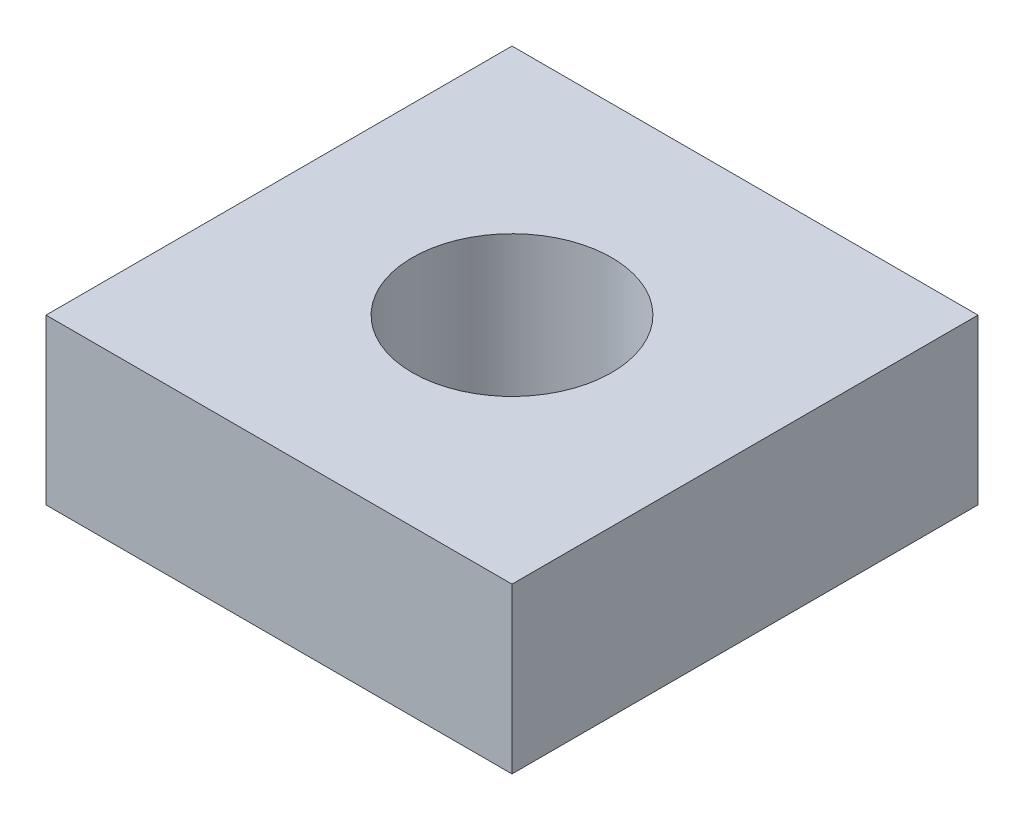
ISO-10303-21;
HEADER;
FILE_DESCRIPTION(('STEP AP214'),'2;1');
FILE_NAME('part.step','',(''),(''),'','','');
FILE_SCHEMA(('AUTOMOTIVE_DESIGN { 1 0 10303 214 1 1 1 1 }'));
ENDSEC;
DATA;
#1=APPLICATION_CONTEXT('core data for automotive mechanical design processes');
#2=APPLICATION_PROTOCOL_DEFINITION('international standard','automotive_design',2000,#1);
#3=PRODUCT_CONTEXT('',#1,'mechanical');
#4=PRODUCT('Part','Part','',(#3));
#5=PRODUCT_RELATED_PRODUCT_CATEGORY('part','',(#4));
#6=PRODUCT_DEFINITION_FORMATION('','',#4);
#7=PRODUCT_DEFINITION_CONTEXT('part definition',#1,'design');
#8=PRODUCT_DEFINITION('design','',#6,#7);
#9=PRODUCT_DEFINITION_SHAPE('','',#8);
#10=(LENGTH_UNIT() NAMED_UNIT(*) SI_UNIT(.MILLI.,.METRE.));
#11=(NAMED_UNIT(*) PLANE_ANGLE_UNIT() SI_UNIT($,.RADIAN.));
#12=(NAMED_UNIT(*) SI_UNIT($,.STERADIAN.) SOLID_ANGLE_UNIT());
#13=UNCERTAINTY_MEASURE_WITH_UNIT(LENGTH_MEASURE(1.E-05),#10,'distance_accuracy_value','');
#14=(GEOMETRIC_REPRESENTATION_CONTEXT(3) GLOBAL_UNCERTAINTY_ASSIGNED_CONTEXT((#13)) GLOBAL_UNIT_ASSIGNED_CONTEXT((#10,
#11,#12)) REPRESENTATION_CONTEXT('',''));
#15=CARTESIAN_POINT('',(0.,0.,0.));
#16=DIRECTION('',(0.,0.,1.));
#17=DIRECTION('',(1.,0.,0.));
#18=AXIS2_PLACEMENT_3D('',#15,#16,#17);
#19=CARTESIAN_POINT('',(0.,3.175,0.));
#20=DIRECTION('',(0.,1.,0.));
#21=DIRECTION('',(0.,0.,1.));
#22=AXIS2_PLACEMENT_3D('',#19,#20,#21);
#23=PLANE('',#22);
#24=DIRECTION('',(0.,0.,-1.));
#25=VECTOR('',#24,1.);
#26=CARTESIAN_POINT('',(0.,3.175,0.));
#27=LINE('',#26,#25);
#28=CARTESIAN_POINT('',(0.,3.175,0.));
#29=VERTEX_POINT('',#28);
#30=CARTESIAN_POINT('',(0.,3.175,-9.));
#31=VERTEX_POINT('',#30);
#32=EDGE_CURVE('E98',#29,#31,#27,.T.);
#33=ORIENTED_EDGE('',*,*,#32,.T.);
#34=DIRECTION('',(-1.,0.,0.));
#35=VECTOR('',#34,1.);
#36=CARTESIAN_POINT('',(0.,3.175,-9.));
#37=LINE('',#36,#35);
#38=CARTESIAN_POINT('',(-9.,3.175,-9.));
#39=VERTEX_POINT('',#38);
#40=EDGE_CURVE('E93',#31,#39,#37,.T.);
#41=ORIENTED_EDGE('',*,*,#40,.T.);
#42=DIRECTION('',(0.,0.,1.));
#43=VECTOR('',#42,1.);
#44=CARTESIAN_POINT('',(-9.,3.175,0.));
#45=LINE('',#44,#43);
#46=CARTESIAN_POINT('',(-9.,3.175,0.));
#47=VERTEX_POINT('',#46);
#48=EDGE_CURVE('E96',#39,#47,#45,.T.);
#49=ORIENTED_EDGE('',*,*,#48,.T.);
#50=DIRECTION('',(1.,0.,0.));
#51=VECTOR('',#50,1.);
#52=CARTESIAN_POINT('',(0.,3.175,0.));
#53=LINE('',#52,#51);
#54=EDGE_CURVE('E63',#47,#29,#53,.T.);
#55=ORIENTED_EDGE('',*,*,#54,.T.);
#56=EDGE_LOOP('',(#33,#41,#49,#55));
#57=FACE_BOUND('',#56,.T.);
#58=CARTESIAN_POINT('',(-4.5,3.175,-4.5));
#59=DIRECTION('',(0.,1.,0.));
#60=DIRECTION('',(0.,0.,1.));
#61=AXIS2_PLACEMENT_3D('',#58,#59,#60);
#62=CIRCLE('',#61,1.925);
#63=CARTESIAN_POINT('',(-4.5,3.175,-2.575));
#64=VERTEX_POINT('',#63);
#65=EDGE_CURVE('E118',#64,#64,#62,.T.);
#66=ORIENTED_EDGE('',*,*,#65,.F.);
#67=EDGE_LOOP('',(#66));
#68=FACE_BOUND('',#67,.T.);
#69=ADVANCED_FACE('F45',(#57,#68),#23,.T.);
#70=CARTESIAN_POINT('',(0.,0.,0.));
#71=DIRECTION('',(0.,1.,0.));
#72=DIRECTION('',(0.,0.,1.));
#73=AXIS2_PLACEMENT_3D('',#70,#71,#72);
#74=PLANE('',#73);
#75=DIRECTION('',(0.,0.,-1.));
#76=VECTOR('',#75,1.);
#77=CARTESIAN_POINT('',(0.,0.,0.));
#78=LINE('',#77,#76);
#79=CARTESIAN_POINT('',(0.,0.,0.));
#80=VERTEX_POINT('',#79);
#81=CARTESIAN_POINT('',(0.,0.,-9.));
#82=VERTEX_POINT('',#81);
#83=EDGE_CURVE('E114',#80,#82,#78,.T.);
#84=ORIENTED_EDGE('',*,*,#83,.F.);
#85=DIRECTION('',(1.,0.,0.));
#86=VECTOR('',#85,1.);
#87=CARTESIAN_POINT('',(0.,0.,0.));
#88=LINE('',#87,#86);
#89=CARTESIAN_POINT('',(-9.,0.,0.));
#90=VERTEX_POINT('',#89);
#91=EDGE_CURVE('E86',#90,#80,#88,.T.);
#92=ORIENTED_EDGE('',*,*,#91,.F.);
#93=DIRECTION('',(0.,0.,1.));
#94=VECTOR('',#93,1.);
#95=CARTESIAN_POINT('',(-9.,0.,0.));
#96=LINE('',#95,#94);
#97=CARTESIAN_POINT('',(-9.,0.,-9.));
#98=VERTEX_POINT('',#97);
#99=EDGE_CURVE('E80',#98,#90,#96,.T.);
#100=ORIENTED_EDGE('',*,*,#99,.F.);
#101=DIRECTION('',(-1.,0.,0.));
#102=VECTOR('',#101,1.);
#103=CARTESIAN_POINT('',(0.,0.,-9.));
#104=LINE('',#103,#102);
#105=EDGE_CURVE('E103',#82,#98,#104,.T.);
#106=ORIENTED_EDGE('',*,*,#105,.F.);
#107=EDGE_LOOP('',(#84,#92,#100,#106));
#108=FACE_BOUND('',#107,.T.);
#109=CARTESIAN_POINT('',(-4.5,0.,-4.5));
#110=DIRECTION('',(0.,1.,0.));
#111=DIRECTION('',(0.,0.,1.));
#112=AXIS2_PLACEMENT_3D('',#109,#110,#111);
#113=CIRCLE('',#112,1.925);
#114=CARTESIAN_POINT('',(-4.5,0.,-2.575));
#115=VERTEX_POINT('',#114);
#116=EDGE_CURVE('E136',#115,#115,#113,.T.);
#117=ORIENTED_EDGE('',*,*,#116,.T.);
#118=EDGE_LOOP('',(#117));
#119=FACE_BOUND('',#118,.T.);
#120=ADVANCED_FACE('F131',(#108,#119),#74,.F.);
#121=CARTESIAN_POINT('',(0.,3.175,0.));
#122=DIRECTION('',(-1.,0.,0.));
#123=DIRECTION('',(0.,0.,1.));
#124=AXIS2_PLACEMENT_3D('',#121,#122,#123);
#125=PLANE('',#124);
#126=ORIENTED_EDGE('',*,*,#83,.T.);
#127=DIRECTION('',(0.,-1.,0.));
#128=VECTOR('',#127,1.);
#129=CARTESIAN_POINT('',(0.,3.175,-9.));
#130=LINE('',#129,#128);
#131=EDGE_CURVE('E11',#31,#82,#130,.T.);
#132=ORIENTED_EDGE('',*,*,#131,.F.);
#133=ORIENTED_EDGE('',*,*,#32,.F.);
#134=DIRECTION('',(0.,-1.,0.));
#135=VECTOR('',#134,1.);
#136=CARTESIAN_POINT('',(0.,3.175,0.));
#137=LINE('',#136,#135);
#138=EDGE_CURVE('E110',#29,#80,#137,.T.);
#139=ORIENTED_EDGE('',*,*,#138,.T.);
#140=EDGE_LOOP('',(#126,#132,#133,#139));
#141=FACE_BOUND('',#140,.T.);
#142=ADVANCED_FACE('F47',(#141),#125,.F.);
#143=CARTESIAN_POINT('',(0.,3.175,-9.));
#144=DIRECTION('',(0.,0.,1.));
#145=DIRECTION('',(1.,0.,0.));
#146=AXIS2_PLACEMENT_3D('',#143,#144,#145);
#147=PLANE('',#146);
#148=ORIENTED_EDGE('',*,*,#105,.T.);
#149=DIRECTION('',(0.,-1.,0.));
#150=VECTOR('',#149,1.);
#151=CARTESIAN_POINT('',(-9.,3.175,-9.));
#152=LINE('',#151,#150);
#153=EDGE_CURVE('E55',#39,#98,#152,.T.);
#154=ORIENTED_EDGE('',*,*,#153,.F.);
#155=ORIENTED_EDGE('',*,*,#40,.F.);
#156=ORIENTED_EDGE('',*,*,#131,.T.);
#157=EDGE_LOOP('',(#148,#154,#155,#156));
#158=FACE_BOUND('',#157,.T.);
#159=ADVANCED_FACE('F102',(#158),#147,.F.);
#160=CARTESIAN_POINT('',(-9.,3.175,0.));
#161=DIRECTION('',(1.,0.,0.));
#162=DIRECTION('',(0.,0.,-1.));
#163=AXIS2_PLACEMENT_3D('',#160,#161,#162);
#164=PLANE('',#163);
#165=ORIENTED_EDGE('',*,*,#99,.T.);
#166=DIRECTION('',(0.,-1.,0.));
#167=VECTOR('',#166,1.);
#168=CARTESIAN_POINT('',(-9.,3.175,0.));
#169=LINE('',#168,#167);
#170=EDGE_CURVE('E105',#47,#90,#169,.T.);
#171=ORIENTED_EDGE('',*,*,#170,.F.);
#172=ORIENTED_EDGE('',*,*,#48,.F.);
#173=ORIENTED_EDGE('',*,*,#153,.T.);
#174=EDGE_LOOP('',(#165,#171,#172,#173));
#175=FACE_BOUND('',#174,.T.);
#176=ADVANCED_FACE('F106',(#175),#164,.F.);
#177=CARTESIAN_POINT('',(0.,3.175,0.));
#178=DIRECTION('',(0.,0.,-1.));
#179=DIRECTION('',(-1.,0.,0.));
#180=AXIS2_PLACEMENT_3D('',#177,#178,#179);
#181=PLANE('',#180);
#182=ORIENTED_EDGE('',*,*,#91,.T.);
#183=ORIENTED_EDGE('',*,*,#138,.F.);
#184=ORIENTED_EDGE('',*,*,#54,.F.);
#185=ORIENTED_EDGE('',*,*,#170,.T.);
#186=EDGE_LOOP('',(#182,#183,#184,#185));
#187=FACE_BOUND('',#186,.T.);
#188=ADVANCED_FACE('F128',(#187),#181,.F.);
#189=CARTESIAN_POINT('',(-4.5,3.175,-4.5));
#190=DIRECTION('',(0.,-1.,0.));
#191=DIRECTION('',(0.,0.,-1.));
#192=AXIS2_PLACEMENT_3D('',#189,#190,#191);
#193=CYLINDRICAL_SURFACE('',#192,1.925);
#194=ORIENTED_EDGE('',*,*,#65,.T.);
#195=EDGE_LOOP('',(#194));
#196=FACE_BOUND('',#195,.T.);
#197=ORIENTED_EDGE('',*,*,#116,.F.);
#198=EDGE_LOOP('',(#197));
#199=FACE_BOUND('',#198,.T.);
#200=ADVANCED_FACE('F144',(#196,#199),#193,.F.);
#201=CLOSED_SHELL('',(#69,#120,#142,#159,#176,#188,#200));
#202=MANIFOLD_SOLID_BREP('B2',#201);
#203=ADVANCED_BREP_SHAPE_REPRESENTATION('',(#18,#202),#14);
#204=SHAPE_DEFINITION_REPRESENTATION(#9,#203);
ENDSEC;
END-ISO-10303-21;
